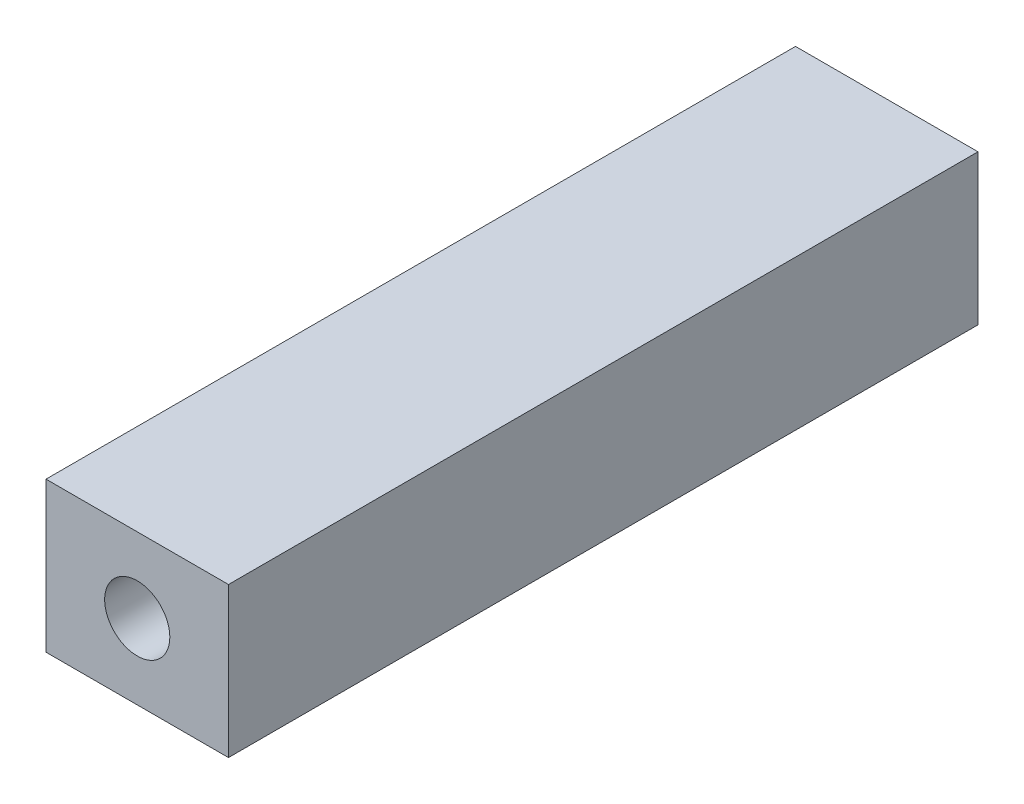
ISO-10303-21;
HEADER;
FILE_DESCRIPTION(('STEP AP214'),'2;1');
FILE_NAME('part.step','',(''),(''),'','','');
FILE_SCHEMA(('AUTOMOTIVE_DESIGN { 1 0 10303 214 1 1 1 1 }'));
ENDSEC;
DATA;
#1=APPLICATION_CONTEXT('core data for automotive mechanical design processes');
#2=APPLICATION_PROTOCOL_DEFINITION('international standard','automotive_design',2000,#1);
#3=PRODUCT_CONTEXT('',#1,'mechanical');
#4=PRODUCT('Part','Part','',(#3));
#5=PRODUCT_RELATED_PRODUCT_CATEGORY('part','',(#4));
#6=PRODUCT_DEFINITION_FORMATION('','',#4);
#7=PRODUCT_DEFINITION_CONTEXT('part definition',#1,'design');
#8=PRODUCT_DEFINITION('design','',#6,#7);
#9=PRODUCT_DEFINITION_SHAPE('','',#8);
#10=(LENGTH_UNIT() NAMED_UNIT(*) SI_UNIT(.MILLI.,.METRE.));
#11=(NAMED_UNIT(*) PLANE_ANGLE_UNIT() SI_UNIT($,.RADIAN.));
#12=(NAMED_UNIT(*) SI_UNIT($,.STERADIAN.) SOLID_ANGLE_UNIT());
#13=UNCERTAINTY_MEASURE_WITH_UNIT(LENGTH_MEASURE(1.E-05),#10,'distance_accuracy_value','');
#14=(GEOMETRIC_REPRESENTATION_CONTEXT(3) GLOBAL_UNCERTAINTY_ASSIGNED_CONTEXT((#13)) GLOBAL_UNIT_ASSIGNED_CONTEXT((#10,
#11,#12)) REPRESENTATION_CONTEXT('',''));
#15=CARTESIAN_POINT('',(0.,0.,0.));
#16=DIRECTION('',(0.,0.,1.));
#17=DIRECTION('',(1.,0.,0.));
#18=AXIS2_PLACEMENT_3D('',#15,#16,#17);
#19=CARTESIAN_POINT('',(0.,0.,57.5));
#20=DIRECTION('',(0.,0.,1.));
#21=DIRECTION('',(1.,0.,0.));
#22=AXIS2_PLACEMENT_3D('',#19,#20,#21);
#23=PLANE('',#22);
#24=DIRECTION('',(0.,1.,0.));
#25=VECTOR('',#24,1.);
#26=CARTESIAN_POINT('',(14.,11.5,57.5));
#27=LINE('',#26,#25);
#28=CARTESIAN_POINT('',(14.,-11.5,57.5));
#29=VERTEX_POINT('',#28);
#30=CARTESIAN_POINT('',(14.,11.5,57.5));
#31=VERTEX_POINT('',#30);
#32=EDGE_CURVE('E85',#29,#31,#27,.T.);
#33=ORIENTED_EDGE('',*,*,#32,.T.);
#34=DIRECTION('',(-1.,0.,0.));
#35=VECTOR('',#34,1.);
#36=CARTESIAN_POINT('',(-14.,11.5,57.5));
#37=LINE('',#36,#35);
#38=CARTESIAN_POINT('',(-14.,11.5,57.5));
#39=VERTEX_POINT('',#38);
#40=EDGE_CURVE('E80',#31,#39,#37,.T.);
#41=ORIENTED_EDGE('',*,*,#40,.T.);
#42=DIRECTION('',(0.,-1.,0.));
#43=VECTOR('',#42,1.);
#44=CARTESIAN_POINT('',(-14.,11.5,57.5));
#45=LINE('',#44,#43);
#46=CARTESIAN_POINT('',(-14.,-11.5,57.5));
#47=VERTEX_POINT('',#46);
#48=EDGE_CURVE('E83',#39,#47,#45,.T.);
#49=ORIENTED_EDGE('',*,*,#48,.T.);
#50=DIRECTION('',(1.,0.,0.));
#51=VECTOR('',#50,1.);
#52=CARTESIAN_POINT('',(-14.,-11.5,57.5));
#53=LINE('',#52,#51);
#54=EDGE_CURVE('E50',#47,#29,#53,.T.);
#55=ORIENTED_EDGE('',*,*,#54,.T.);
#56=EDGE_LOOP('',(#33,#41,#49,#55));
#57=FACE_BOUND('',#56,.T.);
#58=CARTESIAN_POINT('',(0.,0.,57.5));
#59=DIRECTION('',(0.,0.,1.));
#60=DIRECTION('',(1.,0.,0.));
#61=AXIS2_PLACEMENT_3D('',#58,#59,#60);
#62=CIRCLE('',#61,5.);
#63=CARTESIAN_POINT('',(4.99999999999999,0.,57.5));
#64=VERTEX_POINT('',#63);
#65=EDGE_CURVE('E100',#64,#64,#62,.T.);
#66=ORIENTED_EDGE('',*,*,#65,.F.);
#67=EDGE_LOOP('',(#66));
#68=FACE_BOUND('',#67,.T.);
#69=ADVANCED_FACE('F33',(#57,#68),#23,.T.);
#70=CARTESIAN_POINT('',(0.,0.,-57.5));
#71=DIRECTION('',(0.,0.,1.));
#72=DIRECTION('',(1.,0.,0.));
#73=AXIS2_PLACEMENT_3D('',#70,#71,#72);
#74=PLANE('',#73);
#75=DIRECTION('',(0.,1.,0.));
#76=VECTOR('',#75,1.);
#77=CARTESIAN_POINT('',(14.,11.5,-57.5));
#78=LINE('',#77,#76);
#79=CARTESIAN_POINT('',(14.,-11.5,-57.5));
#80=VERTEX_POINT('',#79);
#81=CARTESIAN_POINT('',(14.,11.5,-57.5));
#82=VERTEX_POINT('',#81);
#83=EDGE_CURVE('E97',#80,#82,#78,.T.);
#84=ORIENTED_EDGE('',*,*,#83,.F.);
#85=DIRECTION('',(1.,0.,0.));
#86=VECTOR('',#85,1.);
#87=CARTESIAN_POINT('',(-14.,-11.5,-57.5));
#88=LINE('',#87,#86);
#89=CARTESIAN_POINT('',(-14.,-11.5,-57.5));
#90=VERTEX_POINT('',#89);
#91=EDGE_CURVE('E73',#90,#80,#88,.T.);
#92=ORIENTED_EDGE('',*,*,#91,.F.);
#93=DIRECTION('',(0.,-1.,0.));
#94=VECTOR('',#93,1.);
#95=CARTESIAN_POINT('',(-14.,11.5,-57.5));
#96=LINE('',#95,#94);
#97=CARTESIAN_POINT('',(-14.,11.5,-57.5));
#98=VERTEX_POINT('',#97);
#99=EDGE_CURVE('E67',#98,#90,#96,.T.);
#100=ORIENTED_EDGE('',*,*,#99,.F.);
#101=DIRECTION('',(-1.,0.,0.));
#102=VECTOR('',#101,1.);
#103=CARTESIAN_POINT('',(-14.,11.5,-57.5));
#104=LINE('',#103,#102);
#105=EDGE_CURVE('E89',#82,#98,#104,.T.);
#106=ORIENTED_EDGE('',*,*,#105,.F.);
#107=EDGE_LOOP('',(#84,#92,#100,#106));
#108=FACE_BOUND('',#107,.T.);
#109=CARTESIAN_POINT('',(0.,0.,-57.5));
#110=DIRECTION('',(0.,0.,1.));
#111=DIRECTION('',(1.,0.,0.));
#112=AXIS2_PLACEMENT_3D('',#109,#110,#111);
#113=CIRCLE('',#112,5.);
#114=CARTESIAN_POINT('',(4.99999999999999,0.,-57.5));
#115=VERTEX_POINT('',#114);
#116=EDGE_CURVE('E112',#115,#115,#113,.T.);
#117=ORIENTED_EDGE('',*,*,#116,.T.);
#118=EDGE_LOOP('',(#117));
#119=FACE_BOUND('',#118,.T.);
#120=ADVANCED_FACE('F108',(#108,#119),#74,.F.);
#121=CARTESIAN_POINT('',(14.,11.5,57.5));
#122=DIRECTION('',(-1.,0.,0.));
#123=DIRECTION('',(0.,-1.,0.));
#124=AXIS2_PLACEMENT_3D('',#121,#122,#123);
#125=PLANE('',#124);
#126=ORIENTED_EDGE('',*,*,#83,.T.);
#127=DIRECTION('',(0.,0.,-1.));
#128=VECTOR('',#127,1.);
#129=CARTESIAN_POINT('',(14.,11.5,57.5));
#130=LINE('',#129,#128);
#131=EDGE_CURVE('E11',#31,#82,#130,.T.);
#132=ORIENTED_EDGE('',*,*,#131,.F.);
#133=ORIENTED_EDGE('',*,*,#32,.F.);
#134=DIRECTION('',(0.,0.,-1.));
#135=VECTOR('',#134,1.);
#136=CARTESIAN_POINT('',(14.,-11.5,57.5));
#137=LINE('',#136,#135);
#138=EDGE_CURVE('E93',#29,#80,#137,.T.);
#139=ORIENTED_EDGE('',*,*,#138,.T.);
#140=EDGE_LOOP('',(#126,#132,#133,#139));
#141=FACE_BOUND('',#140,.T.);
#142=ADVANCED_FACE('F35',(#141),#125,.F.);
#143=CARTESIAN_POINT('',(-14.,11.5,57.5));
#144=DIRECTION('',(0.,-1.,0.));
#145=DIRECTION('',(0.,0.,-1.));
#146=AXIS2_PLACEMENT_3D('',#143,#144,#145);
#147=PLANE('',#146);
#148=ORIENTED_EDGE('',*,*,#105,.T.);
#149=DIRECTION('',(0.,0.,-1.));
#150=VECTOR('',#149,1.);
#151=CARTESIAN_POINT('',(-14.,11.5,57.5));
#152=LINE('',#151,#150);
#153=EDGE_CURVE('E42',#39,#98,#152,.T.);
#154=ORIENTED_EDGE('',*,*,#153,.F.);
#155=ORIENTED_EDGE('',*,*,#40,.F.);
#156=ORIENTED_EDGE('',*,*,#131,.T.);
#157=EDGE_LOOP('',(#148,#154,#155,#156));
#158=FACE_BOUND('',#157,.T.);
#159=ADVANCED_FACE('F88',(#158),#147,.F.);
#160=CARTESIAN_POINT('',(-14.,11.5,57.5));
#161=DIRECTION('',(1.,0.,0.));
#162=DIRECTION('',(0.,1.,0.));
#163=AXIS2_PLACEMENT_3D('',#160,#161,#162);
#164=PLANE('',#163);
#165=ORIENTED_EDGE('',*,*,#99,.T.);
#166=DIRECTION('',(0.,0.,-1.));
#167=VECTOR('',#166,1.);
#168=CARTESIAN_POINT('',(-14.,-11.5,57.5));
#169=LINE('',#168,#167);
#170=EDGE_CURVE('E90',#47,#90,#169,.T.);
#171=ORIENTED_EDGE('',*,*,#170,.F.);
#172=ORIENTED_EDGE('',*,*,#48,.F.);
#173=ORIENTED_EDGE('',*,*,#153,.T.);
#174=EDGE_LOOP('',(#165,#171,#172,#173));
#175=FACE_BOUND('',#174,.T.);
#176=ADVANCED_FACE('F91',(#175),#164,.F.);
#177=CARTESIAN_POINT('',(-14.,-11.5,57.5));
#178=DIRECTION('',(0.,1.,0.));
#179=DIRECTION('',(0.,0.,1.));
#180=AXIS2_PLACEMENT_3D('',#177,#178,#179);
#181=PLANE('',#180);
#182=ORIENTED_EDGE('',*,*,#91,.T.);
#183=ORIENTED_EDGE('',*,*,#138,.F.);
#184=ORIENTED_EDGE('',*,*,#54,.F.);
#185=ORIENTED_EDGE('',*,*,#170,.T.);
#186=EDGE_LOOP('',(#182,#183,#184,#185));
#187=FACE_BOUND('',#186,.T.);
#188=ADVANCED_FACE('F105',(#187),#181,.F.);
#189=CARTESIAN_POINT('',(0.,0.,57.5));
#190=DIRECTION('',(0.,0.,-1.));
#191=DIRECTION('',(-1.,0.,0.));
#192=AXIS2_PLACEMENT_3D('',#189,#190,#191);
#193=CYLINDRICAL_SURFACE('',#192,5.);
#194=ORIENTED_EDGE('',*,*,#65,.T.);
#195=EDGE_LOOP('',(#194));
#196=FACE_BOUND('',#195,.T.);
#197=ORIENTED_EDGE('',*,*,#116,.F.);
#198=EDGE_LOOP('',(#197));
#199=FACE_BOUND('',#198,.T.);
#200=ADVANCED_FACE('F118',(#196,#199),#193,.F.);
#201=CLOSED_SHELL('',(#69,#120,#142,#159,#176,#188,#200));
#202=MANIFOLD_SOLID_BREP('B2',#201);
#203=ADVANCED_BREP_SHAPE_REPRESENTATION('',(#18,#202),#14);
#204=SHAPE_DEFINITION_REPRESENTATION(#9,#203);
ENDSEC;
END-ISO-10303-21;
